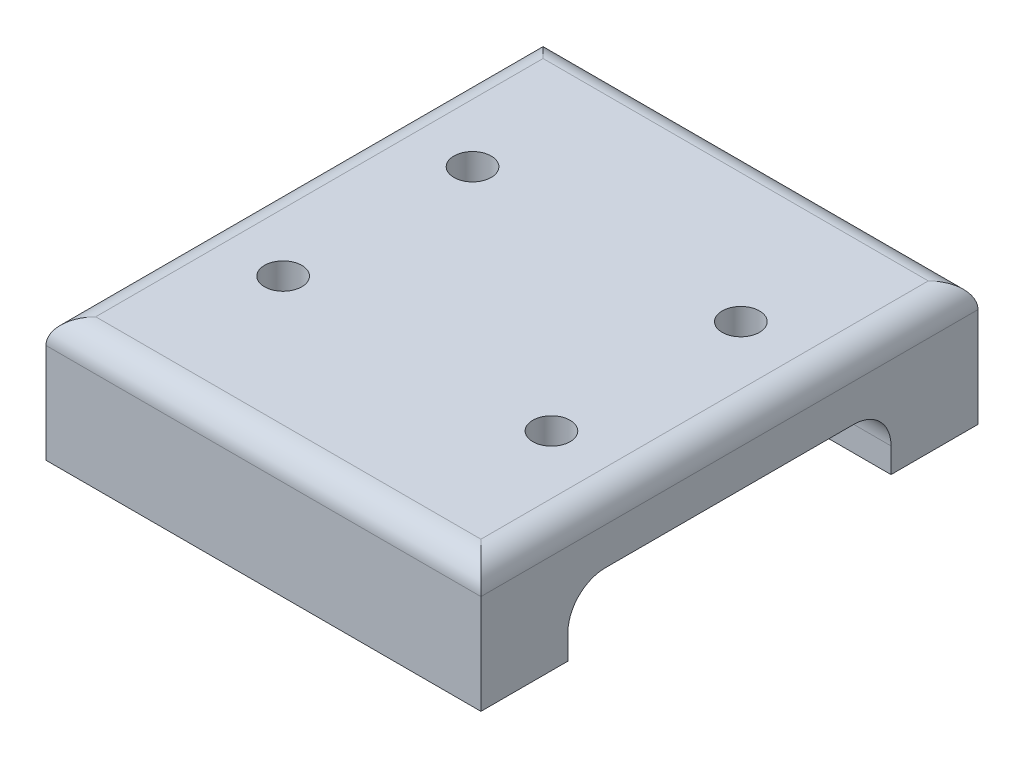
ISO-10303-21;
HEADER;
FILE_DESCRIPTION(('STEP AP214'),'2;1');
FILE_NAME('part.step','',(''),(''),'','','');
FILE_SCHEMA(('AUTOMOTIVE_DESIGN { 1 0 10303 214 1 1 1 1 }'));
ENDSEC;
DATA;
#1=APPLICATION_CONTEXT('core data for automotive mechanical design processes');
#2=APPLICATION_PROTOCOL_DEFINITION('international standard','automotive_design',2000,#1);
#3=PRODUCT_CONTEXT('',#1,'mechanical');
#4=PRODUCT('Part','Part','',(#3));
#5=PRODUCT_RELATED_PRODUCT_CATEGORY('part','',(#4));
#6=PRODUCT_DEFINITION_FORMATION('','',#4);
#7=PRODUCT_DEFINITION_CONTEXT('part definition',#1,'design');
#8=PRODUCT_DEFINITION('design','',#6,#7);
#9=PRODUCT_DEFINITION_SHAPE('','',#8);
#10=(LENGTH_UNIT() NAMED_UNIT(*) SI_UNIT(.MILLI.,.METRE.));
#11=(NAMED_UNIT(*) PLANE_ANGLE_UNIT() SI_UNIT($,.RADIAN.));
#12=(NAMED_UNIT(*) SI_UNIT($,.STERADIAN.) SOLID_ANGLE_UNIT());
#13=UNCERTAINTY_MEASURE_WITH_UNIT(LENGTH_MEASURE(1.E-05),#10,'distance_accuracy_value','');
#14=(GEOMETRIC_REPRESENTATION_CONTEXT(3) GLOBAL_UNCERTAINTY_ASSIGNED_CONTEXT((#13)) GLOBAL_UNIT_ASSIGNED_CONTEXT((#10,
#11,#12)) REPRESENTATION_CONTEXT('',''));
#15=CARTESIAN_POINT('',(0.,0.,0.));
#16=DIRECTION('',(0.,0.,1.));
#17=DIRECTION('',(1.,0.,0.));
#18=AXIS2_PLACEMENT_3D('',#15,#16,#17);
#19=CARTESIAN_POINT('',(0.,0.,0.));
#20=DIRECTION('',(0.,1.,0.));
#21=DIRECTION('',(0.,0.,1.));
#22=AXIS2_PLACEMENT_3D('',#19,#20,#21);
#23=PLANE('',#22);
#24=CARTESIAN_POINT('',(-10.795,0.,-7.62));
#25=DIRECTION('',(0.,1.,0.));
#26=DIRECTION('',(0.,0.,1.));
#27=AXIS2_PLACEMENT_3D('',#24,#25,#26);
#28=CIRCLE('',#27,1.5);
#29=CARTESIAN_POINT('',(-10.795,0.,-6.12));
#30=VERTEX_POINT('',#29);
#31=EDGE_CURVE('E211',#30,#30,#28,.T.);
#32=ORIENTED_EDGE('',*,*,#31,.T.);
#33=EDGE_LOOP('',(#32));
#34=FACE_BOUND('',#33,.T.);
#35=CARTESIAN_POINT('',(10.795,0.,7.62));
#36=DIRECTION('',(0.,1.,0.));
#37=DIRECTION('',(0.,0.,1.));
#38=AXIS2_PLACEMENT_3D('',#35,#36,#37);
#39=CIRCLE('',#38,1.5);
#40=CARTESIAN_POINT('',(10.795,0.,9.12));
#41=VERTEX_POINT('',#40);
#42=EDGE_CURVE('E192',#41,#41,#39,.T.);
#43=ORIENTED_EDGE('',*,*,#42,.T.);
#44=EDGE_LOOP('',(#43));
#45=FACE_BOUND('',#44,.T.);
#46=CARTESIAN_POINT('',(-10.795,0.,7.62));
#47=DIRECTION('',(0.,1.,0.));
#48=DIRECTION('',(0.,0.,1.));
#49=AXIS2_PLACEMENT_3D('',#46,#47,#48);
#50=CIRCLE('',#49,1.5);
#51=CARTESIAN_POINT('',(-10.795,0.,9.12));
#52=VERTEX_POINT('',#51);
#53=EDGE_CURVE('E196',#52,#52,#50,.T.);
#54=ORIENTED_EDGE('',*,*,#53,.T.);
#55=EDGE_LOOP('',(#54));
#56=FACE_BOUND('',#55,.T.);
#57=CARTESIAN_POINT('',(10.795,0.,-7.62));
#58=DIRECTION('',(0.,1.,0.));
#59=DIRECTION('',(0.,0.,1.));
#60=AXIS2_PLACEMENT_3D('',#57,#58,#59);
#61=CIRCLE('',#60,1.5);
#62=CARTESIAN_POINT('',(10.795,0.,-6.12));
#63=VERTEX_POINT('',#62);
#64=EDGE_CURVE('E203',#63,#63,#61,.T.);
#65=ORIENTED_EDGE('',*,*,#64,.T.);
#66=EDGE_LOOP('',(#65));
#67=FACE_BOUND('',#66,.T.);
#68=DIRECTION('',(0.,0.,1.));
#69=VECTOR('',#68,1.);
#70=CARTESIAN_POINT('',(-17.5,0.,20.));
#71=LINE('',#70,#69);
#72=CARTESIAN_POINT('',(-17.5,0.,-10.));
#73=VERTEX_POINT('',#72);
#74=CARTESIAN_POINT('',(-17.5,0.,10.));
#75=VERTEX_POINT('',#74);
#76=EDGE_CURVE('E214',#73,#75,#71,.T.);
#77=ORIENTED_EDGE('',*,*,#76,.F.);
#78=DIRECTION('',(1.,0.,0.));
#79=VECTOR('',#78,1.);
#80=CARTESIAN_POINT('',(0.,0.,-10.));
#81=LINE('',#80,#79);
#82=CARTESIAN_POINT('',(17.5,0.,-10.));
#83=VERTEX_POINT('',#82);
#84=EDGE_CURVE('E251',#73,#83,#81,.T.);
#85=ORIENTED_EDGE('',*,*,#84,.T.);
#86=DIRECTION('',(0.,0.,-1.));
#87=VECTOR('',#86,1.);
#88=CARTESIAN_POINT('',(17.5,0.,20.));
#89=LINE('',#88,#87);
#90=CARTESIAN_POINT('',(17.5,0.,10.));
#91=VERTEX_POINT('',#90);
#92=EDGE_CURVE('E137',#91,#83,#89,.T.);
#93=ORIENTED_EDGE('',*,*,#92,.F.);
#94=DIRECTION('',(1.,0.,0.));
#95=VECTOR('',#94,1.);
#96=CARTESIAN_POINT('',(-17.5,0.,10.));
#97=LINE('',#96,#95);
#98=EDGE_CURVE('E227',#91,#75,#97,.F.);
#99=ORIENTED_EDGE('',*,*,#98,.T.);
#100=EDGE_LOOP('',(#77,#85,#93,#99));
#101=FACE_BOUND('',#100,.T.);
#102=ADVANCED_FACE('F38',(#34,#45,#56,#67,#101),#23,.F.);
#103=CARTESIAN_POINT('',(-17.5,5.,20.));
#104=DIRECTION('',(1.,0.,0.));
#105=DIRECTION('',(0.,0.,-1.));
#106=AXIS2_PLACEMENT_3D('',#103,#104,#105);
#107=PLANE('',#106);
#108=DIRECTION('',(0.,-1.,0.));
#109=VECTOR('',#108,1.);
#110=CARTESIAN_POINT('',(-17.5,5.,20.));
#111=LINE('',#110,#109);
#112=CARTESIAN_POINT('',(-17.5,3.,20.));
#113=VERTEX_POINT('',#112);
#114=CARTESIAN_POINT('',(-17.5,-5.,20.));
#115=VERTEX_POINT('',#114);
#116=EDGE_CURVE('E222',#113,#115,#111,.T.);
#117=ORIENTED_EDGE('',*,*,#116,.F.);
#118=DIRECTION('',(0.,0.,1.));
#119=VECTOR('',#118,1.);
#120=CARTESIAN_POINT('',(-17.5,3.,-20.));
#121=LINE('',#120,#119);
#122=CARTESIAN_POINT('',(-17.5,3.,-20.));
#123=VERTEX_POINT('',#122);
#124=EDGE_CURVE('E132',#113,#123,#121,.F.);
#125=ORIENTED_EDGE('',*,*,#124,.T.);
#126=DIRECTION('',(0.,-1.,0.));
#127=VECTOR('',#126,1.);
#128=CARTESIAN_POINT('',(-17.5,5.,-20.));
#129=LINE('',#128,#127);
#130=CARTESIAN_POINT('',(-17.5,-5.,-20.));
#131=VERTEX_POINT('',#130);
#132=EDGE_CURVE('E125',#123,#131,#129,.T.);
#133=ORIENTED_EDGE('',*,*,#132,.T.);
#134=DIRECTION('',(0.,0.,1.));
#135=VECTOR('',#134,1.);
#136=CARTESIAN_POINT('',(-17.5,-5.,-13.));
#137=LINE('',#136,#135);
#138=CARTESIAN_POINT('',(-17.5,-5.,-13.));
#139=VERTEX_POINT('',#138);
#140=EDGE_CURVE('E129',#131,#139,#137,.T.);
#141=ORIENTED_EDGE('',*,*,#140,.T.);
#142=DIRECTION('',(0.,1.,0.));
#143=VECTOR('',#142,1.);
#144=CARTESIAN_POINT('',(-17.5,-5.,-13.));
#145=LINE('',#144,#143);
#146=CARTESIAN_POINT('',(-17.5,-3.,-13.));
#147=VERTEX_POINT('',#146);
#148=EDGE_CURVE('E157',#139,#147,#145,.T.);
#149=ORIENTED_EDGE('',*,*,#148,.T.);
#150=CARTESIAN_POINT('',(-17.5,-3.,-10.));
#151=DIRECTION('',(1.,0.,0.));
#152=DIRECTION('',(0.,0.,-1.));
#153=AXIS2_PLACEMENT_3D('',#150,#151,#152);
#154=CIRCLE('',#153,3.);
#155=EDGE_CURVE('E11',#147,#73,#154,.T.);
#156=ORIENTED_EDGE('',*,*,#155,.T.);
#157=ORIENTED_EDGE('',*,*,#76,.T.);
#158=CARTESIAN_POINT('',(-17.5,-3.,10.));
#159=DIRECTION('',(1.,0.,0.));
#160=DIRECTION('',(0.,0.,-1.));
#161=AXIS2_PLACEMENT_3D('',#158,#159,#160);
#162=CIRCLE('',#161,3.);
#163=CARTESIAN_POINT('',(-17.5,-3.,13.));
#164=VERTEX_POINT('',#163);
#165=EDGE_CURVE('E232',#75,#164,#162,.T.);
#166=ORIENTED_EDGE('',*,*,#165,.T.);
#167=DIRECTION('',(0.,1.,0.));
#168=VECTOR('',#167,1.);
#169=CARTESIAN_POINT('',(-17.5,-5.,13.));
#170=LINE('',#169,#168);
#171=CARTESIAN_POINT('',(-17.5,-5.,13.));
#172=VERTEX_POINT('',#171);
#173=EDGE_CURVE('E189',#172,#164,#170,.T.);
#174=ORIENTED_EDGE('',*,*,#173,.F.);
#175=DIRECTION('',(0.,0.,-1.));
#176=VECTOR('',#175,1.);
#177=CARTESIAN_POINT('',(-17.5,-5.,13.));
#178=LINE('',#177,#176);
#179=EDGE_CURVE('E165',#115,#172,#178,.T.);
#180=ORIENTED_EDGE('',*,*,#179,.F.);
#181=EDGE_LOOP('',(#117,#125,#133,#141,#149,#156,#157,#166,#174,#180));
#182=FACE_BOUND('',#181,.T.);
#183=ADVANCED_FACE('F128',(#182),#107,.F.);
#184=CARTESIAN_POINT('',(17.5,5.,20.));
#185=DIRECTION('',(0.,0.,-1.));
#186=DIRECTION('',(-1.,0.,0.));
#187=AXIS2_PLACEMENT_3D('',#184,#185,#186);
#188=PLANE('',#187);
#189=DIRECTION('',(0.,-1.,0.));
#190=VECTOR('',#189,1.);
#191=CARTESIAN_POINT('',(17.5,5.,20.));
#192=LINE('',#191,#190);
#193=CARTESIAN_POINT('',(17.5,3.,20.));
#194=VERTEX_POINT('',#193);
#195=CARTESIAN_POINT('',(17.5,-5.,20.));
#196=VERTEX_POINT('',#195);
#197=EDGE_CURVE('E220',#194,#196,#192,.T.);
#198=ORIENTED_EDGE('',*,*,#197,.F.);
#199=DIRECTION('',(1.,0.,0.));
#200=VECTOR('',#199,1.);
#201=CARTESIAN_POINT('',(-17.5,3.,20.));
#202=LINE('',#201,#200);
#203=EDGE_CURVE('E243',#194,#113,#202,.F.);
#204=ORIENTED_EDGE('',*,*,#203,.T.);
#205=ORIENTED_EDGE('',*,*,#116,.T.);
#206=DIRECTION('',(-1.,0.,0.));
#207=VECTOR('',#206,1.);
#208=CARTESIAN_POINT('',(17.5,-5.,20.));
#209=LINE('',#208,#207);
#210=EDGE_CURVE('E183',#196,#115,#209,.T.);
#211=ORIENTED_EDGE('',*,*,#210,.F.);
#212=EDGE_LOOP('',(#198,#204,#205,#211));
#213=FACE_BOUND('',#212,.T.);
#214=ADVANCED_FACE('F294',(#213),#188,.F.);
#215=CARTESIAN_POINT('',(17.5,5.,20.));
#216=DIRECTION('',(-1.,0.,0.));
#217=DIRECTION('',(0.,0.,1.));
#218=AXIS2_PLACEMENT_3D('',#215,#216,#217);
#219=PLANE('',#218);
#220=DIRECTION('',(0.,-1.,0.));
#221=VECTOR('',#220,1.);
#222=CARTESIAN_POINT('',(17.5,5.,-20.));
#223=LINE('',#222,#221);
#224=CARTESIAN_POINT('',(17.5,3.,-20.));
#225=VERTEX_POINT('',#224);
#226=CARTESIAN_POINT('',(17.5,-5.,-20.));
#227=VERTEX_POINT('',#226);
#228=EDGE_CURVE('E136',#225,#227,#223,.T.);
#229=ORIENTED_EDGE('',*,*,#228,.F.);
#230=DIRECTION('',(0.,0.,-1.));
#231=VECTOR('',#230,1.);
#232=CARTESIAN_POINT('',(17.5,3.,20.));
#233=LINE('',#232,#231);
#234=EDGE_CURVE('E246',#225,#194,#233,.F.);
#235=ORIENTED_EDGE('',*,*,#234,.T.);
#236=ORIENTED_EDGE('',*,*,#197,.T.);
#237=DIRECTION('',(0.,0.,1.));
#238=VECTOR('',#237,1.);
#239=CARTESIAN_POINT('',(17.5,-5.,13.));
#240=LINE('',#239,#238);
#241=CARTESIAN_POINT('',(17.5,-5.,13.));
#242=VERTEX_POINT('',#241);
#243=EDGE_CURVE('E180',#242,#196,#240,.T.);
#244=ORIENTED_EDGE('',*,*,#243,.F.);
#245=DIRECTION('',(0.,1.,0.));
#246=VECTOR('',#245,1.);
#247=CARTESIAN_POINT('',(17.5,-5.,13.));
#248=LINE('',#247,#246);
#249=CARTESIAN_POINT('',(17.5,-3.,13.));
#250=VERTEX_POINT('',#249);
#251=EDGE_CURVE('E186',#242,#250,#248,.T.);
#252=ORIENTED_EDGE('',*,*,#251,.T.);
#253=CARTESIAN_POINT('',(17.5,-3.,10.));
#254=DIRECTION('',(-1.,0.,0.));
#255=DIRECTION('',(0.,0.,1.));
#256=AXIS2_PLACEMENT_3D('',#253,#254,#255);
#257=CIRCLE('',#256,3.);
#258=EDGE_CURVE('E230',#250,#91,#257,.T.);
#259=ORIENTED_EDGE('',*,*,#258,.T.);
#260=ORIENTED_EDGE('',*,*,#92,.T.);
#261=CARTESIAN_POINT('',(17.5,-3.,-10.));
#262=DIRECTION('',(-1.,0.,0.));
#263=DIRECTION('',(0.,0.,1.));
#264=AXIS2_PLACEMENT_3D('',#261,#262,#263);
#265=CIRCLE('',#264,3.);
#266=CARTESIAN_POINT('',(17.5,-3.,-13.));
#267=VERTEX_POINT('',#266);
#268=EDGE_CURVE('E46',#83,#267,#265,.T.);
#269=ORIENTED_EDGE('',*,*,#268,.T.);
#270=DIRECTION('',(0.,1.,0.));
#271=VECTOR('',#270,1.);
#272=CARTESIAN_POINT('',(17.5,-5.,-13.));
#273=LINE('',#272,#271);
#274=CARTESIAN_POINT('',(17.5,-5.,-13.));
#275=VERTEX_POINT('',#274);
#276=EDGE_CURVE('E159',#275,#267,#273,.T.);
#277=ORIENTED_EDGE('',*,*,#276,.F.);
#278=DIRECTION('',(0.,0.,-1.));
#279=VECTOR('',#278,1.);
#280=CARTESIAN_POINT('',(17.5,-5.,-13.));
#281=LINE('',#280,#279);
#282=EDGE_CURVE('E151',#275,#227,#281,.T.);
#283=ORIENTED_EDGE('',*,*,#282,.T.);
#284=EDGE_LOOP('',(#229,#235,#236,#244,#252,#259,#260,#269,#277,#283));
#285=FACE_BOUND('',#284,.T.);
#286=ADVANCED_FACE('F269',(#285),#219,.F.);
#287=CARTESIAN_POINT('',(17.5,5.,-20.));
#288=DIRECTION('',(0.,0.,1.));
#289=DIRECTION('',(1.,0.,0.));
#290=AXIS2_PLACEMENT_3D('',#287,#288,#289);
#291=PLANE('',#290);
#292=ORIENTED_EDGE('',*,*,#132,.F.);
#293=DIRECTION('',(-1.,0.,0.));
#294=VECTOR('',#293,1.);
#295=CARTESIAN_POINT('',(17.5,3.,-20.));
#296=LINE('',#295,#294);
#297=EDGE_CURVE('E248',#123,#225,#296,.F.);
#298=ORIENTED_EDGE('',*,*,#297,.T.);
#299=ORIENTED_EDGE('',*,*,#228,.T.);
#300=DIRECTION('',(-1.,0.,0.));
#301=VECTOR('',#300,1.);
#302=CARTESIAN_POINT('',(17.5,-5.,-20.));
#303=LINE('',#302,#301);
#304=EDGE_CURVE('E143',#227,#131,#303,.T.);
#305=ORIENTED_EDGE('',*,*,#304,.T.);
#306=EDGE_LOOP('',(#292,#298,#299,#305));
#307=FACE_BOUND('',#306,.T.);
#308=ADVANCED_FACE('F149',(#307),#291,.F.);
#309=CARTESIAN_POINT('',(0.,5.,0.));
#310=DIRECTION('',(0.,1.,0.));
#311=DIRECTION('',(0.,0.,1.));
#312=AXIS2_PLACEMENT_3D('',#309,#310,#311);
#313=PLANE('',#312);
#314=DIRECTION('',(0.,0.,1.));
#315=VECTOR('',#314,1.);
#316=CARTESIAN_POINT('',(-15.5,5.,20.));
#317=LINE('',#316,#315);
#318=CARTESIAN_POINT('',(-15.5,5.,-18.));
#319=VERTEX_POINT('',#318);
#320=CARTESIAN_POINT('',(-15.5,5.,18.));
#321=VERTEX_POINT('',#320);
#322=EDGE_CURVE('E234',#319,#321,#317,.T.);
#323=ORIENTED_EDGE('',*,*,#322,.T.);
#324=DIRECTION('',(1.,0.,0.));
#325=VECTOR('',#324,1.);
#326=CARTESIAN_POINT('',(17.5,5.,18.));
#327=LINE('',#326,#325);
#328=CARTESIAN_POINT('',(15.5,5.,18.));
#329=VERTEX_POINT('',#328);
#330=EDGE_CURVE('E240',#321,#329,#327,.T.);
#331=ORIENTED_EDGE('',*,*,#330,.T.);
#332=DIRECTION('',(0.,0.,-1.));
#333=VECTOR('',#332,1.);
#334=CARTESIAN_POINT('',(15.5,5.,-20.));
#335=LINE('',#334,#333);
#336=CARTESIAN_POINT('',(15.5,5.,-18.));
#337=VERTEX_POINT('',#336);
#338=EDGE_CURVE('E238',#329,#337,#335,.T.);
#339=ORIENTED_EDGE('',*,*,#338,.T.);
#340=DIRECTION('',(-1.,0.,0.));
#341=VECTOR('',#340,1.);
#342=CARTESIAN_POINT('',(-17.5,5.,-18.));
#343=LINE('',#342,#341);
#344=EDGE_CURVE('E236',#337,#319,#343,.T.);
#345=ORIENTED_EDGE('',*,*,#344,.T.);
#346=EDGE_LOOP('',(#323,#331,#339,#345));
#347=FACE_BOUND('',#346,.T.);
#348=CARTESIAN_POINT('',(10.795,5.,-7.62));
#349=DIRECTION('',(0.,1.,0.));
#350=DIRECTION('',(0.,0.,1.));
#351=AXIS2_PLACEMENT_3D('',#348,#349,#350);
#352=CIRCLE('',#351,1.5);
#353=CARTESIAN_POINT('',(10.795,5.,-6.12));
#354=VERTEX_POINT('',#353);
#355=EDGE_CURVE('E199',#354,#354,#352,.T.);
#356=ORIENTED_EDGE('',*,*,#355,.F.);
#357=EDGE_LOOP('',(#356));
#358=FACE_BOUND('',#357,.T.);
#359=CARTESIAN_POINT('',(-10.795,5.,7.62));
#360=DIRECTION('',(0.,1.,0.));
#361=DIRECTION('',(0.,0.,1.));
#362=AXIS2_PLACEMENT_3D('',#359,#360,#361);
#363=CIRCLE('',#362,1.5);
#364=CARTESIAN_POINT('',(-10.795,5.,9.12));
#365=VERTEX_POINT('',#364);
#366=EDGE_CURVE('E206',#365,#365,#363,.T.);
#367=ORIENTED_EDGE('',*,*,#366,.F.);
#368=EDGE_LOOP('',(#367));
#369=FACE_BOUND('',#368,.T.);
#370=CARTESIAN_POINT('',(10.795,5.,7.62));
#371=DIRECTION('',(0.,1.,0.));
#372=DIRECTION('',(0.,0.,1.));
#373=AXIS2_PLACEMENT_3D('',#370,#371,#372);
#374=CIRCLE('',#373,1.5);
#375=CARTESIAN_POINT('',(10.795,5.,9.12));
#376=VERTEX_POINT('',#375);
#377=EDGE_CURVE('E193',#376,#376,#374,.T.);
#378=ORIENTED_EDGE('',*,*,#377,.F.);
#379=EDGE_LOOP('',(#378));
#380=FACE_BOUND('',#379,.T.);
#381=CARTESIAN_POINT('',(-10.795,5.,-7.62));
#382=DIRECTION('',(0.,1.,0.));
#383=DIRECTION('',(0.,0.,1.));
#384=AXIS2_PLACEMENT_3D('',#381,#382,#383);
#385=CIRCLE('',#384,1.5);
#386=CARTESIAN_POINT('',(-10.795,5.,-6.12));
#387=VERTEX_POINT('',#386);
#388=EDGE_CURVE('E202',#387,#387,#385,.T.);
#389=ORIENTED_EDGE('',*,*,#388,.F.);
#390=EDGE_LOOP('',(#389));
#391=FACE_BOUND('',#390,.T.);
#392=ADVANCED_FACE('F299',(#347,#358,#369,#380,#391),#313,.T.);
#393=CARTESIAN_POINT('',(-10.795,0.,-7.62));
#394=DIRECTION('',(0.,1.,0.));
#395=DIRECTION('',(0.,0.,1.));
#396=AXIS2_PLACEMENT_3D('',#393,#394,#395);
#397=CYLINDRICAL_SURFACE('',#396,1.5);
#398=ORIENTED_EDGE('',*,*,#31,.F.);
#399=EDGE_LOOP('',(#398));
#400=FACE_BOUND('',#399,.T.);
#401=ORIENTED_EDGE('',*,*,#388,.T.);
#402=EDGE_LOOP('',(#401));
#403=FACE_BOUND('',#402,.T.);
#404=ADVANCED_FACE('F343',(#400,#403),#397,.F.);
#405=CARTESIAN_POINT('',(10.795,0.,7.62));
#406=DIRECTION('',(0.,1.,0.));
#407=DIRECTION('',(0.,0.,1.));
#408=AXIS2_PLACEMENT_3D('',#405,#406,#407);
#409=CYLINDRICAL_SURFACE('',#408,1.5);
#410=ORIENTED_EDGE('',*,*,#42,.F.);
#411=EDGE_LOOP('',(#410));
#412=FACE_BOUND('',#411,.T.);
#413=ORIENTED_EDGE('',*,*,#377,.T.);
#414=EDGE_LOOP('',(#413));
#415=FACE_BOUND('',#414,.T.);
#416=ADVANCED_FACE('F353',(#412,#415),#409,.F.);
#417=CARTESIAN_POINT('',(-10.795,0.,7.62));
#418=DIRECTION('',(0.,1.,0.));
#419=DIRECTION('',(0.,0.,1.));
#420=AXIS2_PLACEMENT_3D('',#417,#418,#419);
#421=CYLINDRICAL_SURFACE('',#420,1.5);
#422=ORIENTED_EDGE('',*,*,#53,.F.);
#423=EDGE_LOOP('',(#422));
#424=FACE_BOUND('',#423,.T.);
#425=ORIENTED_EDGE('',*,*,#366,.T.);
#426=EDGE_LOOP('',(#425));
#427=FACE_BOUND('',#426,.T.);
#428=ADVANCED_FACE('F358',(#424,#427),#421,.F.);
#429=CARTESIAN_POINT('',(10.795,0.,-7.62));
#430=DIRECTION('',(0.,1.,0.));
#431=DIRECTION('',(0.,0.,1.));
#432=AXIS2_PLACEMENT_3D('',#429,#430,#431);
#433=CYLINDRICAL_SURFACE('',#432,1.5);
#434=ORIENTED_EDGE('',*,*,#64,.F.);
#435=EDGE_LOOP('',(#434));
#436=FACE_BOUND('',#435,.T.);
#437=ORIENTED_EDGE('',*,*,#355,.T.);
#438=EDGE_LOOP('',(#437));
#439=FACE_BOUND('',#438,.T.);
#440=ADVANCED_FACE('F365',(#436,#439),#433,.F.);
#441=CARTESIAN_POINT('',(17.5,-5.,13.));
#442=DIRECTION('',(0.,0.,1.));
#443=DIRECTION('',(1.,0.,0.));
#444=AXIS2_PLACEMENT_3D('',#441,#442,#443);
#445=PLANE('',#444);
#446=ORIENTED_EDGE('',*,*,#173,.T.);
#447=DIRECTION('',(1.,0.,0.));
#448=VECTOR('',#447,1.);
#449=CARTESIAN_POINT('',(17.5,-3.,13.));
#450=LINE('',#449,#448);
#451=EDGE_CURVE('E224',#164,#250,#450,.T.);
#452=ORIENTED_EDGE('',*,*,#451,.T.);
#453=ORIENTED_EDGE('',*,*,#251,.F.);
#454=DIRECTION('',(1.,0.,0.));
#455=VECTOR('',#454,1.);
#456=CARTESIAN_POINT('',(17.5,-5.,13.));
#457=LINE('',#456,#455);
#458=EDGE_CURVE('E178',#172,#242,#457,.T.);
#459=ORIENTED_EDGE('',*,*,#458,.F.);
#460=EDGE_LOOP('',(#446,#452,#453,#459));
#461=FACE_BOUND('',#460,.T.);
#462=ADVANCED_FACE('F277',(#461),#445,.F.);
#463=CARTESIAN_POINT('',(0.,-5.,0.));
#464=DIRECTION('',(0.,-1.,0.));
#465=DIRECTION('',(0.,0.,-1.));
#466=AXIS2_PLACEMENT_3D('',#463,#464,#465);
#467=PLANE('',#466);
#468=CARTESIAN_POINT('',(-10.,-5.,16.5));
#469=DIRECTION('',(0.,-1.,0.));
#470=DIRECTION('',(0.,0.,-1.));
#471=AXIS2_PLACEMENT_3D('',#468,#469,#470);
#472=CIRCLE('',#471,2.);
#473=CARTESIAN_POINT('',(-10.,-5.,14.5));
#474=VERTEX_POINT('',#473);
#475=EDGE_CURVE('E166',#474,#474,#472,.T.);
#476=ORIENTED_EDGE('',*,*,#475,.F.);
#477=EDGE_LOOP('',(#476));
#478=FACE_BOUND('',#477,.T.);
#479=CARTESIAN_POINT('',(10.,-5.,16.5));
#480=DIRECTION('',(0.,-1.,0.));
#481=DIRECTION('',(0.,0.,-1.));
#482=AXIS2_PLACEMENT_3D('',#479,#480,#481);
#483=CIRCLE('',#482,2.);
#484=CARTESIAN_POINT('',(10.,-5.,14.5));
#485=VERTEX_POINT('',#484);
#486=EDGE_CURVE('E169',#485,#485,#483,.T.);
#487=ORIENTED_EDGE('',*,*,#486,.F.);
#488=EDGE_LOOP('',(#487));
#489=FACE_BOUND('',#488,.T.);
#490=ORIENTED_EDGE('',*,*,#179,.T.);
#491=ORIENTED_EDGE('',*,*,#458,.T.);
#492=ORIENTED_EDGE('',*,*,#243,.T.);
#493=ORIENTED_EDGE('',*,*,#210,.T.);
#494=EDGE_LOOP('',(#490,#491,#492,#493));
#495=FACE_BOUND('',#494,.T.);
#496=ADVANCED_FACE('F372',(#478,#489,#495),#467,.T.);
#497=CARTESIAN_POINT('',(10.,3.5,16.5));
#498=DIRECTION('',(0.,-1.,0.));
#499=DIRECTION('',(0.,0.,-1.));
#500=AXIS2_PLACEMENT_3D('',#497,#498,#499);
#501=CYLINDRICAL_SURFACE('',#500,2.);
#502=CARTESIAN_POINT('',(10.,3.5,16.5));
#503=DIRECTION('',(0.,-1.,0.));
#504=DIRECTION('',(0.,0.,-1.));
#505=AXIS2_PLACEMENT_3D('',#502,#503,#504);
#506=CIRCLE('',#505,2.);
#507=CARTESIAN_POINT('',(10.,3.5,14.5));
#508=VERTEX_POINT('',#507);
#509=EDGE_CURVE('E172',#508,#508,#506,.T.);
#510=ORIENTED_EDGE('',*,*,#509,.F.);
#511=EDGE_LOOP('',(#510));
#512=FACE_BOUND('',#511,.T.);
#513=ORIENTED_EDGE('',*,*,#486,.T.);
#514=EDGE_LOOP('',(#513));
#515=FACE_BOUND('',#514,.T.);
#516=ADVANCED_FACE('F375',(#512,#515),#501,.F.);
#517=CARTESIAN_POINT('',(10.,3.5,16.5));
#518=DIRECTION('',(0.,-1.,0.));
#519=DIRECTION('',(0.,0.,-1.));
#520=AXIS2_PLACEMENT_3D('',#517,#518,#519);
#521=PLANE('',#520);
#522=ORIENTED_EDGE('',*,*,#509,.T.);
#523=EDGE_LOOP('',(#522));
#524=FACE_BOUND('',#523,.T.);
#525=ADVANCED_FACE('F377',(#524),#521,.T.);
#526=CARTESIAN_POINT('',(-10.,3.5,16.5));
#527=DIRECTION('',(0.,-1.,0.));
#528=DIRECTION('',(0.,0.,-1.));
#529=AXIS2_PLACEMENT_3D('',#526,#527,#528);
#530=CYLINDRICAL_SURFACE('',#529,2.);
#531=CARTESIAN_POINT('',(-10.,3.5,16.5));
#532=DIRECTION('',(0.,-1.,0.));
#533=DIRECTION('',(0.,0.,-1.));
#534=AXIS2_PLACEMENT_3D('',#531,#532,#533);
#535=CIRCLE('',#534,2.);
#536=CARTESIAN_POINT('',(-10.,3.5,14.5));
#537=VERTEX_POINT('',#536);
#538=EDGE_CURVE('E162',#537,#537,#535,.T.);
#539=ORIENTED_EDGE('',*,*,#538,.F.);
#540=EDGE_LOOP('',(#539));
#541=FACE_BOUND('',#540,.T.);
#542=ORIENTED_EDGE('',*,*,#475,.T.);
#543=EDGE_LOOP('',(#542));
#544=FACE_BOUND('',#543,.T.);
#545=ADVANCED_FACE('F380',(#541,#544),#530,.F.);
#546=CARTESIAN_POINT('',(-10.,3.5,16.5));
#547=DIRECTION('',(0.,-1.,0.));
#548=DIRECTION('',(0.,0.,-1.));
#549=AXIS2_PLACEMENT_3D('',#546,#547,#548);
#550=PLANE('',#549);
#551=ORIENTED_EDGE('',*,*,#538,.T.);
#552=EDGE_LOOP('',(#551));
#553=FACE_BOUND('',#552,.T.);
#554=ADVANCED_FACE('F311',(#553),#550,.T.);
#555=CARTESIAN_POINT('',(17.5,-3.,10.));
#556=DIRECTION('',(-1.,0.,0.));
#557=DIRECTION('',(0.,0.,1.));
#558=AXIS2_PLACEMENT_3D('',#555,#556,#557);
#559=CYLINDRICAL_SURFACE('',#558,3.);
#560=ORIENTED_EDGE('',*,*,#165,.F.);
#561=ORIENTED_EDGE('',*,*,#98,.F.);
#562=ORIENTED_EDGE('',*,*,#258,.F.);
#563=ORIENTED_EDGE('',*,*,#451,.F.);
#564=EDGE_LOOP('',(#560,#561,#562,#563));
#565=FACE_BOUND('',#564,.T.);
#566=ADVANCED_FACE('F275',(#565),#559,.F.);
#567=CARTESIAN_POINT('',(0.,3.,-18.));
#568=DIRECTION('',(1.,0.,0.));
#569=DIRECTION('',(0.,0.,-1.));
#570=AXIS2_PLACEMENT_3D('',#567,#568,#569);
#571=CYLINDRICAL_SURFACE('',#570,2.);
#572=CARTESIAN_POINT('',(15.5,3.,-18.));
#573=DIRECTION('',(0.707106781186548,0.,0.707106781186547));
#574=DIRECTION('',(0.707106781186547,0.,-0.707106781186547));
#575=AXIS2_PLACEMENT_3D('',#572,#573,#574);
#576=ELLIPSE('',#575,2.82842712474619,2.);
#577=EDGE_CURVE('E255',#225,#337,#576,.T.);
#578=ORIENTED_EDGE('',*,*,#577,.F.);
#579=ORIENTED_EDGE('',*,*,#297,.F.);
#580=CARTESIAN_POINT('',(-15.5,3.,-18.));
#581=DIRECTION('',(0.707106781186547,0.,-0.707106781186547));
#582=DIRECTION('',(-0.707106781186548,0.,-0.707106781186547));
#583=AXIS2_PLACEMENT_3D('',#580,#581,#582);
#584=ELLIPSE('',#583,2.82842712474619,2.);
#585=EDGE_CURVE('E175',#319,#123,#584,.F.);
#586=ORIENTED_EDGE('',*,*,#585,.F.);
#587=ORIENTED_EDGE('',*,*,#344,.F.);
#588=EDGE_LOOP('',(#578,#579,#586,#587));
#589=FACE_BOUND('',#588,.T.);
#590=ADVANCED_FACE('F310',(#589),#571,.T.);
#591=CARTESIAN_POINT('',(-15.5,3.,0.));
#592=DIRECTION('',(0.,0.,-1.));
#593=DIRECTION('',(-1.,0.,0.));
#594=AXIS2_PLACEMENT_3D('',#591,#592,#593);
#595=CYLINDRICAL_SURFACE('',#594,2.);
#596=ORIENTED_EDGE('',*,*,#585,.T.);
#597=ORIENTED_EDGE('',*,*,#124,.F.);
#598=CARTESIAN_POINT('',(-15.5,3.,18.));
#599=DIRECTION('',(-0.707106781186548,0.,-0.707106781186547));
#600=DIRECTION('',(0.707106781186547,0.,-0.707106781186547));
#601=AXIS2_PLACEMENT_3D('',#598,#599,#600);
#602=ELLIPSE('',#601,2.82842712474619,2.);
#603=EDGE_CURVE('E253',#321,#113,#602,.F.);
#604=ORIENTED_EDGE('',*,*,#603,.F.);
#605=ORIENTED_EDGE('',*,*,#322,.F.);
#606=EDGE_LOOP('',(#596,#597,#604,#605));
#607=FACE_BOUND('',#606,.T.);
#608=ADVANCED_FACE('F320',(#607),#595,.T.);
#609=CARTESIAN_POINT('',(15.5,3.,0.));
#610=DIRECTION('',(0.,0.,1.));
#611=DIRECTION('',(1.,0.,0.));
#612=AXIS2_PLACEMENT_3D('',#609,#610,#611);
#613=CYLINDRICAL_SURFACE('',#612,2.);
#614=ORIENTED_EDGE('',*,*,#577,.T.);
#615=ORIENTED_EDGE('',*,*,#338,.F.);
#616=CARTESIAN_POINT('',(15.5,3.,18.));
#617=DIRECTION('',(-0.707106781186547,0.,0.707106781186547));
#618=DIRECTION('',(0.707106781186548,0.,0.707106781186547));
#619=AXIS2_PLACEMENT_3D('',#616,#617,#618);
#620=ELLIPSE('',#619,2.82842712474619,2.);
#621=EDGE_CURVE('E161',#194,#329,#620,.T.);
#622=ORIENTED_EDGE('',*,*,#621,.F.);
#623=ORIENTED_EDGE('',*,*,#234,.F.);
#624=EDGE_LOOP('',(#614,#615,#622,#623));
#625=FACE_BOUND('',#624,.T.);
#626=ADVANCED_FACE('F316',(#625),#613,.T.);
#627=CARTESIAN_POINT('',(0.,3.,18.));
#628=DIRECTION('',(-1.,0.,0.));
#629=DIRECTION('',(0.,0.,1.));
#630=AXIS2_PLACEMENT_3D('',#627,#628,#629);
#631=CYLINDRICAL_SURFACE('',#630,2.);
#632=ORIENTED_EDGE('',*,*,#603,.T.);
#633=ORIENTED_EDGE('',*,*,#203,.F.);
#634=ORIENTED_EDGE('',*,*,#621,.T.);
#635=ORIENTED_EDGE('',*,*,#330,.F.);
#636=EDGE_LOOP('',(#632,#633,#634,#635));
#637=FACE_BOUND('',#636,.T.);
#638=ADVANCED_FACE('F312',(#637),#631,.T.);
#639=CARTESIAN_POINT('',(17.5,-5.,-13.));
#640=DIRECTION('',(0.,0.,1.));
#641=DIRECTION('',(1.,0.,0.));
#642=AXIS2_PLACEMENT_3D('',#639,#640,#641);
#643=PLANE('',#642);
#644=ORIENTED_EDGE('',*,*,#276,.T.);
#645=DIRECTION('',(1.,0.,0.));
#646=VECTOR('',#645,1.);
#647=CARTESIAN_POINT('',(17.5,-3.,-13.));
#648=LINE('',#647,#646);
#649=EDGE_CURVE('E59',#267,#147,#648,.F.);
#650=ORIENTED_EDGE('',*,*,#649,.T.);
#651=ORIENTED_EDGE('',*,*,#148,.F.);
#652=DIRECTION('',(1.,0.,0.));
#653=VECTOR('',#652,1.);
#654=CARTESIAN_POINT('',(17.5,-5.,-13.));
#655=LINE('',#654,#653);
#656=EDGE_CURVE('E146',#139,#275,#655,.T.);
#657=ORIENTED_EDGE('',*,*,#656,.T.);
#658=EDGE_LOOP('',(#644,#650,#651,#657));
#659=FACE_BOUND('',#658,.T.);
#660=ADVANCED_FACE('F315',(#659),#643,.T.);
#661=CARTESIAN_POINT('',(0.,-5.,0.));
#662=DIRECTION('',(0.,-1.,0.));
#663=DIRECTION('',(0.,0.,1.));
#664=AXIS2_PLACEMENT_3D('',#661,#662,#663);
#665=PLANE('',#664);
#666=CARTESIAN_POINT('',(-10.,-5.,-16.5));
#667=DIRECTION('',(0.,1.,0.));
#668=DIRECTION('',(0.,0.,1.));
#669=AXIS2_PLACEMENT_3D('',#666,#667,#668);
#670=CIRCLE('',#669,2.);
#671=CARTESIAN_POINT('',(-10.,-5.,-14.5));
#672=VERTEX_POINT('',#671);
#673=EDGE_CURVE('E413',#672,#672,#670,.T.);
#674=ORIENTED_EDGE('',*,*,#673,.T.);
#675=EDGE_LOOP('',(#674));
#676=FACE_BOUND('',#675,.T.);
#677=CARTESIAN_POINT('',(10.,-5.,-16.5));
#678=DIRECTION('',(0.,1.,0.));
#679=DIRECTION('',(0.,0.,1.));
#680=AXIS2_PLACEMENT_3D('',#677,#678,#679);
#681=CIRCLE('',#680,2.);
#682=CARTESIAN_POINT('',(10.,-5.,-14.5));
#683=VERTEX_POINT('',#682);
#684=EDGE_CURVE('E418',#683,#683,#681,.T.);
#685=ORIENTED_EDGE('',*,*,#684,.T.);
#686=EDGE_LOOP('',(#685));
#687=FACE_BOUND('',#686,.T.);
#688=ORIENTED_EDGE('',*,*,#140,.F.);
#689=ORIENTED_EDGE('',*,*,#304,.F.);
#690=ORIENTED_EDGE('',*,*,#282,.F.);
#691=ORIENTED_EDGE('',*,*,#656,.F.);
#692=EDGE_LOOP('',(#688,#689,#690,#691));
#693=FACE_BOUND('',#692,.T.);
#694=ADVANCED_FACE('F141',(#676,#687,#693),#665,.T.);
#695=CARTESIAN_POINT('',(10.,3.5,-16.5));
#696=DIRECTION('',(0.,-1.,0.));
#697=DIRECTION('',(0.,0.,-1.));
#698=AXIS2_PLACEMENT_3D('',#695,#696,#697);
#699=CYLINDRICAL_SURFACE('',#698,2.);
#700=CARTESIAN_POINT('',(10.,3.5,-16.5));
#701=DIRECTION('',(0.,1.,0.));
#702=DIRECTION('',(0.,0.,1.));
#703=AXIS2_PLACEMENT_3D('',#700,#701,#702);
#704=CIRCLE('',#703,2.);
#705=CARTESIAN_POINT('',(10.,3.5,-14.5));
#706=VERTEX_POINT('',#705);
#707=EDGE_CURVE('E414',#706,#706,#704,.T.);
#708=ORIENTED_EDGE('',*,*,#707,.T.);
#709=EDGE_LOOP('',(#708));
#710=FACE_BOUND('',#709,.T.);
#711=ORIENTED_EDGE('',*,*,#684,.F.);
#712=EDGE_LOOP('',(#711));
#713=FACE_BOUND('',#712,.T.);
#714=ADVANCED_FACE('F395',(#710,#713),#699,.F.);
#715=CARTESIAN_POINT('',(10.,3.5,-16.5));
#716=DIRECTION('',(0.,-1.,0.));
#717=DIRECTION('',(0.,0.,1.));
#718=AXIS2_PLACEMENT_3D('',#715,#716,#717);
#719=PLANE('',#718);
#720=ORIENTED_EDGE('',*,*,#707,.F.);
#721=EDGE_LOOP('',(#720));
#722=FACE_BOUND('',#721,.T.);
#723=ADVANCED_FACE('F399',(#722),#719,.T.);
#724=CARTESIAN_POINT('',(-10.,3.5,-16.5));
#725=DIRECTION('',(0.,-1.,0.));
#726=DIRECTION('',(0.,0.,-1.));
#727=AXIS2_PLACEMENT_3D('',#724,#725,#726);
#728=CYLINDRICAL_SURFACE('',#727,2.);
#729=CARTESIAN_POINT('',(-10.,3.5,-16.5));
#730=DIRECTION('',(0.,1.,0.));
#731=DIRECTION('',(0.,0.,1.));
#732=AXIS2_PLACEMENT_3D('',#729,#730,#731);
#733=CIRCLE('',#732,2.);
#734=CARTESIAN_POINT('',(-10.,3.5,-14.5));
#735=VERTEX_POINT('',#734);
#736=EDGE_CURVE('E147',#735,#735,#733,.T.);
#737=ORIENTED_EDGE('',*,*,#736,.T.);
#738=EDGE_LOOP('',(#737));
#739=FACE_BOUND('',#738,.T.);
#740=ORIENTED_EDGE('',*,*,#673,.F.);
#741=EDGE_LOOP('',(#740));
#742=FACE_BOUND('',#741,.T.);
#743=ADVANCED_FACE('F285',(#739,#742),#728,.F.);
#744=CARTESIAN_POINT('',(-10.,3.5,-16.5));
#745=DIRECTION('',(0.,-1.,0.));
#746=DIRECTION('',(0.,0.,1.));
#747=AXIS2_PLACEMENT_3D('',#744,#745,#746);
#748=PLANE('',#747);
#749=ORIENTED_EDGE('',*,*,#736,.F.);
#750=EDGE_LOOP('',(#749));
#751=FACE_BOUND('',#750,.T.);
#752=ADVANCED_FACE('F281',(#751),#748,.T.);
#753=CARTESIAN_POINT('',(0.,-3.,-10.));
#754=DIRECTION('',(1.,0.,0.));
#755=DIRECTION('',(0.,0.,-1.));
#756=AXIS2_PLACEMENT_3D('',#753,#754,#755);
#757=CYLINDRICAL_SURFACE('',#756,3.);
#758=ORIENTED_EDGE('',*,*,#155,.F.);
#759=ORIENTED_EDGE('',*,*,#649,.F.);
#760=ORIENTED_EDGE('',*,*,#268,.F.);
#761=ORIENTED_EDGE('',*,*,#84,.F.);
#762=EDGE_LOOP('',(#758,#759,#760,#761));
#763=FACE_BOUND('',#762,.T.);
#764=ADVANCED_FACE('F40',(#763),#757,.F.);
#765=CLOSED_SHELL('',(#102,#183,#214,#286,#308,#392,#404,#416,#428,#440,#462,#496,#516,#525,
#545,#554,#566,#590,#608,#626,#638,#660,#694,#714,#723,#743,#752,#764));
#766=MANIFOLD_SOLID_BREP('B2',#765);
#767=ADVANCED_BREP_SHAPE_REPRESENTATION('',(#18,#766),#14);
#768=SHAPE_DEFINITION_REPRESENTATION(#9,#767);
ENDSEC;
END-ISO-10303-21;
